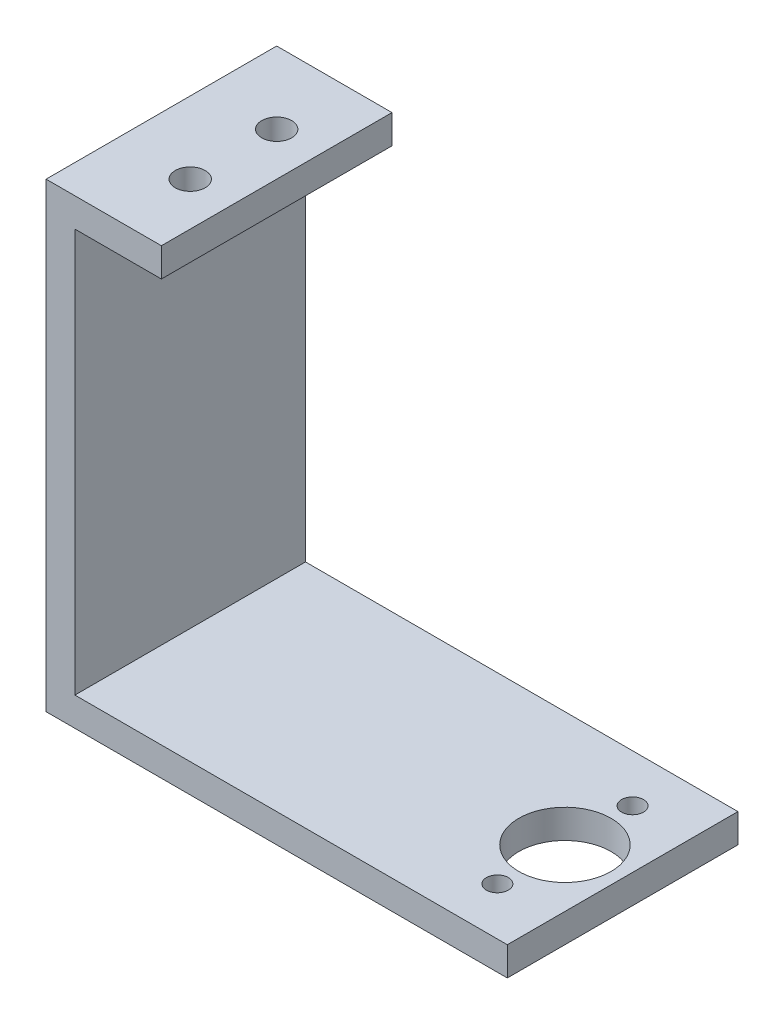
ISO-10303-21;
HEADER;
FILE_DESCRIPTION(('STEP AP214'),'2;1');
FILE_NAME('part.step','',(''),(''),'','','');
FILE_SCHEMA(('AUTOMOTIVE_DESIGN { 1 0 10303 214 1 1 1 1 }'));
ENDSEC;
DATA;
#1=APPLICATION_CONTEXT('core data for automotive mechanical design processes');
#2=APPLICATION_PROTOCOL_DEFINITION('international standard','automotive_design',2000,#1);
#3=PRODUCT_CONTEXT('',#1,'mechanical');
#4=PRODUCT('Part','Part','',(#3));
#5=PRODUCT_RELATED_PRODUCT_CATEGORY('part','',(#4));
#6=PRODUCT_DEFINITION_FORMATION('','',#4);
#7=PRODUCT_DEFINITION_CONTEXT('part definition',#1,'design');
#8=PRODUCT_DEFINITION('design','',#6,#7);
#9=PRODUCT_DEFINITION_SHAPE('','',#8);
#10=(LENGTH_UNIT() NAMED_UNIT(*) SI_UNIT(.MILLI.,.METRE.));
#11=(NAMED_UNIT(*) PLANE_ANGLE_UNIT() SI_UNIT($,.RADIAN.));
#12=(NAMED_UNIT(*) SI_UNIT($,.STERADIAN.) SOLID_ANGLE_UNIT());
#13=UNCERTAINTY_MEASURE_WITH_UNIT(LENGTH_MEASURE(1.E-05),#10,'distance_accuracy_value','');
#14=(GEOMETRIC_REPRESENTATION_CONTEXT(3) GLOBAL_UNCERTAINTY_ASSIGNED_CONTEXT((#13)) GLOBAL_UNIT_ASSIGNED_CONTEXT((#10,
#11,#12)) REPRESENTATION_CONTEXT('',''));
#15=CARTESIAN_POINT('',(0.,0.,0.));
#16=DIRECTION('',(0.,0.,1.));
#17=DIRECTION('',(1.,0.,0.));
#18=AXIS2_PLACEMENT_3D('',#15,#16,#17);
#19=CARTESIAN_POINT('',(-17.0592750793869,26.9872138550957,25.4));
#20=DIRECTION('',(-1.,0.,0.));
#21=DIRECTION('',(0.,0.,1.));
#22=AXIS2_PLACEMENT_3D('',#19,#20,#21);
#23=PLANE('',#22);
#24=DIRECTION('',(0.,1.,0.));
#25=VECTOR('',#24,1.);
#26=CARTESIAN_POINT('',(-17.0592750793869,26.9872138550957,0.));
#27=LINE('',#26,#25);
#28=CARTESIAN_POINT('',(-17.0592750793869,23.8122138550957,0.));
#29=VERTEX_POINT('',#28);
#30=CARTESIAN_POINT('',(-17.0592750793869,26.9872138550957,0.));
#31=VERTEX_POINT('',#30);
#32=EDGE_CURVE('E132',#29,#31,#27,.T.);
#33=ORIENTED_EDGE('',*,*,#32,.T.);
#34=DIRECTION('',(0.,0.,-1.));
#35=VECTOR('',#34,1.);
#36=CARTESIAN_POINT('',(-17.0592750793869,26.9872138550957,25.4));
#37=LINE('',#36,#35);
#38=CARTESIAN_POINT('',(-17.0592750793869,26.9872138550957,25.4));
#39=VERTEX_POINT('',#38);
#40=EDGE_CURVE('E11',#39,#31,#37,.T.);
#41=ORIENTED_EDGE('',*,*,#40,.F.);
#42=DIRECTION('',(0.,1.,0.));
#43=VECTOR('',#42,1.);
#44=CARTESIAN_POINT('',(-17.0592750793869,26.9872138550957,25.4));
#45=LINE('',#44,#43);
#46=CARTESIAN_POINT('',(-17.0592750793869,23.8122138550957,25.4));
#47=VERTEX_POINT('',#46);
#48=EDGE_CURVE('E147',#47,#39,#45,.T.);
#49=ORIENTED_EDGE('',*,*,#48,.F.);
#50=DIRECTION('',(0.,0.,-1.));
#51=VECTOR('',#50,1.);
#52=CARTESIAN_POINT('',(-17.0592750793869,23.8122138550957,25.4));
#53=LINE('',#52,#51);
#54=EDGE_CURVE('E128',#47,#29,#53,.T.);
#55=ORIENTED_EDGE('',*,*,#54,.T.);
#56=EDGE_LOOP('',(#33,#41,#49,#55));
#57=FACE_BOUND('',#56,.T.);
#58=ADVANCED_FACE('F34',(#57),#23,.F.);
#59=CARTESIAN_POINT('',(-17.0592750793869,26.9872138550957,25.4));
#60=DIRECTION('',(0.,-1.,0.));
#61=DIRECTION('',(1.,0.,0.));
#62=AXIS2_PLACEMENT_3D('',#59,#60,#61);
#63=PLANE('',#62);
#64=CARTESIAN_POINT('',(-21.8217750793869,26.9872138550957,7.9375));
#65=DIRECTION('',(0.,1.,0.));
#66=DIRECTION('',(0.,0.,1.));
#67=AXIS2_PLACEMENT_3D('',#64,#65,#66);
#68=CIRCLE('',#67,1.65);
#69=CARTESIAN_POINT('',(-21.8217750793869,26.9872138550957,9.5875));
#70=VERTEX_POINT('',#69);
#71=EDGE_CURVE('E167',#70,#70,#68,.T.);
#72=ORIENTED_EDGE('',*,*,#71,.F.);
#73=EDGE_LOOP('',(#72));
#74=FACE_BOUND('',#73,.T.);
#75=CARTESIAN_POINT('',(-21.8217750793869,26.9872138550957,17.4625));
#76=DIRECTION('',(0.,1.,0.));
#77=DIRECTION('',(0.,0.,1.));
#78=AXIS2_PLACEMENT_3D('',#75,#76,#77);
#79=CIRCLE('',#78,1.65);
#80=CARTESIAN_POINT('',(-21.8217750793869,26.9872138550957,19.1125));
#81=VERTEX_POINT('',#80);
#82=EDGE_CURVE('E159',#81,#81,#79,.T.);
#83=ORIENTED_EDGE('',*,*,#82,.F.);
#84=EDGE_LOOP('',(#83));
#85=FACE_BOUND('',#84,.T.);
#86=DIRECTION('',(-1.,0.,0.));
#87=VECTOR('',#86,1.);
#88=CARTESIAN_POINT('',(-17.0592750793869,26.9872138550957,0.));
#89=LINE('',#88,#87);
#90=CARTESIAN_POINT('',(-29.7592750793869,26.9872138550957,0.));
#91=VERTEX_POINT('',#90);
#92=EDGE_CURVE('E135',#31,#91,#89,.T.);
#93=ORIENTED_EDGE('',*,*,#92,.T.);
#94=DIRECTION('',(0.,0.,-1.));
#95=VECTOR('',#94,1.);
#96=CARTESIAN_POINT('',(-29.7592750793869,26.9872138550957,25.4));
#97=LINE('',#96,#95);
#98=CARTESIAN_POINT('',(-29.7592750793869,26.9872138550957,25.4));
#99=VERTEX_POINT('',#98);
#100=EDGE_CURVE('E43',#99,#91,#97,.T.);
#101=ORIENTED_EDGE('',*,*,#100,.F.);
#102=DIRECTION('',(-1.,0.,0.));
#103=VECTOR('',#102,1.);
#104=CARTESIAN_POINT('',(-17.0592750793869,26.9872138550957,25.4));
#105=LINE('',#104,#103);
#106=EDGE_CURVE('E95',#39,#99,#105,.T.);
#107=ORIENTED_EDGE('',*,*,#106,.F.);
#108=ORIENTED_EDGE('',*,*,#40,.T.);
#109=EDGE_LOOP('',(#93,#101,#107,#108));
#110=FACE_BOUND('',#109,.T.);
#111=ADVANCED_FACE('F205',(#74,#85,#110),#63,.F.);
#112=CARTESIAN_POINT('',(-29.7592750793869,26.9872138550957,25.4));
#113=DIRECTION('',(1.,0.,0.));
#114=DIRECTION('',(0.,1.,0.));
#115=AXIS2_PLACEMENT_3D('',#112,#113,#114);
#116=PLANE('',#115);
#117=DIRECTION('',(0.,-1.,0.));
#118=VECTOR('',#117,1.);
#119=CARTESIAN_POINT('',(-29.7592750793869,26.9872138550957,0.));
#120=LINE('',#119,#118);
#121=CARTESIAN_POINT('',(-29.7592750793869,-23.8127861449043,0.));
#122=VERTEX_POINT('',#121);
#123=EDGE_CURVE('E138',#91,#122,#120,.T.);
#124=ORIENTED_EDGE('',*,*,#123,.T.);
#125=DIRECTION('',(0.,0.,-1.));
#126=VECTOR('',#125,1.);
#127=CARTESIAN_POINT('',(-29.7592750793869,-23.8127861449043,25.4));
#128=LINE('',#127,#126);
#129=CARTESIAN_POINT('',(-29.7592750793869,-23.8127861449043,25.4));
#130=VERTEX_POINT('',#129);
#131=EDGE_CURVE('E154',#130,#122,#128,.T.);
#132=ORIENTED_EDGE('',*,*,#131,.F.);
#133=DIRECTION('',(0.,-1.,0.));
#134=VECTOR('',#133,1.);
#135=CARTESIAN_POINT('',(-29.7592750793869,26.9872138550957,25.4));
#136=LINE('',#135,#134);
#137=EDGE_CURVE('E173',#99,#130,#136,.T.);
#138=ORIENTED_EDGE('',*,*,#137,.F.);
#139=ORIENTED_EDGE('',*,*,#100,.T.);
#140=EDGE_LOOP('',(#124,#132,#138,#139));
#141=FACE_BOUND('',#140,.T.);
#142=ADVANCED_FACE('F209',(#141),#116,.F.);
#143=CARTESIAN_POINT('',(-29.7592750793869,-23.8127861449043,25.4));
#144=DIRECTION('',(0.,1.,0.));
#145=DIRECTION('',(0.,0.,1.));
#146=AXIS2_PLACEMENT_3D('',#143,#144,#145);
#147=PLANE('',#146);
#148=CARTESIAN_POINT('',(14.6907249206131,-23.8127861449043,20.1422));
#149=DIRECTION('',(0.,-1.,0.));
#150=DIRECTION('',(0.,0.,-1.));
#151=AXIS2_PLACEMENT_3D('',#148,#149,#150);
#152=CIRCLE('',#151,1.2065);
#153=CARTESIAN_POINT('',(14.6907249206131,-23.8127861449043,18.9357));
#154=VERTEX_POINT('',#153);
#155=EDGE_CURVE('E250',#154,#154,#152,.T.);
#156=ORIENTED_EDGE('',*,*,#155,.F.);
#157=EDGE_LOOP('',(#156));
#158=FACE_BOUND('',#157,.T.);
#159=CARTESIAN_POINT('',(14.6907249206131,-23.8127861449043,5.2578));
#160=DIRECTION('',(0.,-1.,0.));
#161=DIRECTION('',(0.,0.,-1.));
#162=AXIS2_PLACEMENT_3D('',#159,#160,#161);
#163=CIRCLE('',#162,1.2065);
#164=CARTESIAN_POINT('',(14.6907249206131,-23.8127861449043,4.0513));
#165=VERTEX_POINT('',#164);
#166=EDGE_CURVE('E246',#165,#165,#163,.T.);
#167=ORIENTED_EDGE('',*,*,#166,.F.);
#168=EDGE_LOOP('',(#167));
#169=FACE_BOUND('',#168,.T.);
#170=CARTESIAN_POINT('',(14.6907249206131,-23.8127861449043,12.7));
#171=DIRECTION('',(0.,-1.,0.));
#172=DIRECTION('',(0.,0.,-1.));
#173=AXIS2_PLACEMENT_3D('',#170,#171,#172);
#174=CIRCLE('',#173,5.08);
#175=CARTESIAN_POINT('',(14.6907249206131,-23.8127861449043,7.62));
#176=VERTEX_POINT('',#175);
#177=EDGE_CURVE('E240',#176,#176,#174,.T.);
#178=ORIENTED_EDGE('',*,*,#177,.F.);
#179=EDGE_LOOP('',(#178));
#180=FACE_BOUND('',#179,.T.);
#181=DIRECTION('',(1.,0.,0.));
#182=VECTOR('',#181,1.);
#183=CARTESIAN_POINT('',(-29.7592750793869,-23.8127861449043,0.));
#184=LINE('',#183,#182);
#185=CARTESIAN_POINT('',(21.0407249206131,-23.8127861449043,0.));
#186=VERTEX_POINT('',#185);
#187=EDGE_CURVE('E140',#122,#186,#184,.T.);
#188=ORIENTED_EDGE('',*,*,#187,.T.);
#189=DIRECTION('',(0.,0.,-1.));
#190=VECTOR('',#189,1.);
#191=CARTESIAN_POINT('',(21.0407249206131,-23.8127861449043,25.4));
#192=LINE('',#191,#190);
#193=CARTESIAN_POINT('',(21.0407249206131,-23.8127861449043,25.4));
#194=VERTEX_POINT('',#193);
#195=EDGE_CURVE('E151',#194,#186,#192,.T.);
#196=ORIENTED_EDGE('',*,*,#195,.F.);
#197=DIRECTION('',(1.,0.,0.));
#198=VECTOR('',#197,1.);
#199=CARTESIAN_POINT('',(-29.7592750793869,-23.8127861449043,25.4));
#200=LINE('',#199,#198);
#201=EDGE_CURVE('E175',#130,#194,#200,.T.);
#202=ORIENTED_EDGE('',*,*,#201,.F.);
#203=ORIENTED_EDGE('',*,*,#131,.T.);
#204=EDGE_LOOP('',(#188,#196,#202,#203));
#205=FACE_BOUND('',#204,.T.);
#206=ADVANCED_FACE('F181',(#158,#169,#180,#205),#147,.F.);
#207=CARTESIAN_POINT('',(21.0407249206131,-23.8127861449043,25.4));
#208=DIRECTION('',(-1.,0.,0.));
#209=DIRECTION('',(0.,-1.,0.));
#210=AXIS2_PLACEMENT_3D('',#207,#208,#209);
#211=PLANE('',#210);
#212=DIRECTION('',(0.,1.,0.));
#213=VECTOR('',#212,1.);
#214=CARTESIAN_POINT('',(21.0407249206131,-23.8127861449043,0.));
#215=LINE('',#214,#213);
#216=CARTESIAN_POINT('',(21.0407249206131,-20.6377861449043,0.));
#217=VERTEX_POINT('',#216);
#218=EDGE_CURVE('E142',#186,#217,#215,.T.);
#219=ORIENTED_EDGE('',*,*,#218,.T.);
#220=DIRECTION('',(0.,0.,-1.));
#221=VECTOR('',#220,1.);
#222=CARTESIAN_POINT('',(21.0407249206131,-20.6377861449043,25.4));
#223=LINE('',#222,#221);
#224=CARTESIAN_POINT('',(21.0407249206131,-20.6377861449043,25.4));
#225=VERTEX_POINT('',#224);
#226=EDGE_CURVE('E123',#225,#217,#223,.T.);
#227=ORIENTED_EDGE('',*,*,#226,.F.);
#228=DIRECTION('',(0.,1.,0.));
#229=VECTOR('',#228,1.);
#230=CARTESIAN_POINT('',(21.0407249206131,-23.8127861449043,25.4));
#231=LINE('',#230,#229);
#232=EDGE_CURVE('E114',#194,#225,#231,.T.);
#233=ORIENTED_EDGE('',*,*,#232,.F.);
#234=ORIENTED_EDGE('',*,*,#195,.T.);
#235=EDGE_LOOP('',(#219,#227,#233,#234));
#236=FACE_BOUND('',#235,.T.);
#237=ADVANCED_FACE('F185',(#236),#211,.F.);
#238=CARTESIAN_POINT('',(-26.5842750793869,-20.6377861449043,25.4));
#239=DIRECTION('',(0.,-1.,0.));
#240=DIRECTION('',(0.,0.,-1.));
#241=AXIS2_PLACEMENT_3D('',#238,#239,#240);
#242=PLANE('',#241);
#243=CARTESIAN_POINT('',(14.6907249206131,-20.6377861449043,20.1422));
#244=DIRECTION('',(0.,-1.,0.));
#245=DIRECTION('',(0.,0.,-1.));
#246=AXIS2_PLACEMENT_3D('',#243,#244,#245);
#247=CIRCLE('',#246,1.2065);
#248=CARTESIAN_POINT('',(14.6907249206131,-20.6377861449043,18.9357));
#249=VERTEX_POINT('',#248);
#250=EDGE_CURVE('E231',#249,#249,#247,.F.);
#251=ORIENTED_EDGE('',*,*,#250,.F.);
#252=EDGE_LOOP('',(#251));
#253=FACE_BOUND('',#252,.T.);
#254=CARTESIAN_POINT('',(14.6907249206131,-20.6377861449043,5.2578));
#255=DIRECTION('',(0.,-1.,0.));
#256=DIRECTION('',(0.,0.,-1.));
#257=AXIS2_PLACEMENT_3D('',#254,#255,#256);
#258=CIRCLE('',#257,1.2065);
#259=CARTESIAN_POINT('',(14.6907249206131,-20.6377861449043,4.0513));
#260=VERTEX_POINT('',#259);
#261=EDGE_CURVE('E235',#260,#260,#258,.F.);
#262=ORIENTED_EDGE('',*,*,#261,.F.);
#263=EDGE_LOOP('',(#262));
#264=FACE_BOUND('',#263,.T.);
#265=CARTESIAN_POINT('',(14.6907249206131,-20.6377861449043,12.7));
#266=DIRECTION('',(0.,-1.,0.));
#267=DIRECTION('',(0.,0.,-1.));
#268=AXIS2_PLACEMENT_3D('',#265,#266,#267);
#269=CIRCLE('',#268,5.08);
#270=CARTESIAN_POINT('',(14.6907249206131,-20.6377861449043,7.62));
#271=VERTEX_POINT('',#270);
#272=EDGE_CURVE('E238',#271,#271,#269,.F.);
#273=ORIENTED_EDGE('',*,*,#272,.F.);
#274=EDGE_LOOP('',(#273));
#275=FACE_BOUND('',#274,.T.);
#276=DIRECTION('',(-1.,0.,0.));
#277=VECTOR('',#276,1.);
#278=CARTESIAN_POINT('',(-26.5842750793869,-20.6377861449043,0.));
#279=LINE('',#278,#277);
#280=CARTESIAN_POINT('',(-26.5842750793869,-20.6377861449043,0.));
#281=VERTEX_POINT('',#280);
#282=EDGE_CURVE('E122',#217,#281,#279,.T.);
#283=ORIENTED_EDGE('',*,*,#282,.T.);
#284=DIRECTION('',(0.,0.,-1.));
#285=VECTOR('',#284,1.);
#286=CARTESIAN_POINT('',(-26.5842750793869,-20.6377861449043,25.4));
#287=LINE('',#286,#285);
#288=CARTESIAN_POINT('',(-26.5842750793869,-20.6377861449043,25.4));
#289=VERTEX_POINT('',#288);
#290=EDGE_CURVE('E119',#289,#281,#287,.T.);
#291=ORIENTED_EDGE('',*,*,#290,.F.);
#292=DIRECTION('',(-1.,0.,0.));
#293=VECTOR('',#292,1.);
#294=CARTESIAN_POINT('',(-26.5842750793869,-20.6377861449043,25.4));
#295=LINE('',#294,#293);
#296=EDGE_CURVE('E108',#225,#289,#295,.T.);
#297=ORIENTED_EDGE('',*,*,#296,.F.);
#298=ORIENTED_EDGE('',*,*,#226,.T.);
#299=EDGE_LOOP('',(#283,#291,#297,#298));
#300=FACE_BOUND('',#299,.T.);
#301=ADVANCED_FACE('F120',(#253,#264,#275,#300),#242,.F.);
#302=CARTESIAN_POINT('',(-26.5842750793869,23.8122138550957,25.4));
#303=DIRECTION('',(-1.,0.,0.));
#304=DIRECTION('',(0.,-1.,0.));
#305=AXIS2_PLACEMENT_3D('',#302,#303,#304);
#306=PLANE('',#305);
#307=DIRECTION('',(0.,1.,0.));
#308=VECTOR('',#307,1.);
#309=CARTESIAN_POINT('',(-26.5842750793869,23.8122138550957,0.));
#310=LINE('',#309,#308);
#311=CARTESIAN_POINT('',(-26.5842750793869,23.8122138550957,0.));
#312=VERTEX_POINT('',#311);
#313=EDGE_CURVE('E81',#281,#312,#310,.T.);
#314=ORIENTED_EDGE('',*,*,#313,.T.);
#315=DIRECTION('',(0.,0.,-1.));
#316=VECTOR('',#315,1.);
#317=CARTESIAN_POINT('',(-26.5842750793869,23.8122138550957,25.4));
#318=LINE('',#317,#316);
#319=CARTESIAN_POINT('',(-26.5842750793869,23.8122138550957,25.4));
#320=VERTEX_POINT('',#319);
#321=EDGE_CURVE('E124',#320,#312,#318,.T.);
#322=ORIENTED_EDGE('',*,*,#321,.F.);
#323=DIRECTION('',(0.,1.,0.));
#324=VECTOR('',#323,1.);
#325=CARTESIAN_POINT('',(-26.5842750793869,23.8122138550957,25.4));
#326=LINE('',#325,#324);
#327=EDGE_CURVE('E112',#289,#320,#326,.T.);
#328=ORIENTED_EDGE('',*,*,#327,.F.);
#329=ORIENTED_EDGE('',*,*,#290,.T.);
#330=EDGE_LOOP('',(#314,#322,#328,#329));
#331=FACE_BOUND('',#330,.T.);
#332=ADVANCED_FACE('F126',(#331),#306,.F.);
#333=CARTESIAN_POINT('',(-17.0592750793869,23.8122138550957,25.4));
#334=DIRECTION('',(0.,1.,0.));
#335=DIRECTION('',(0.,0.,1.));
#336=AXIS2_PLACEMENT_3D('',#333,#334,#335);
#337=PLANE('',#336);
#338=CARTESIAN_POINT('',(-21.8217750793869,23.8122138550957,7.9375));
#339=DIRECTION('',(0.,1.,0.));
#340=DIRECTION('',(0.,0.,1.));
#341=AXIS2_PLACEMENT_3D('',#338,#339,#340);
#342=CIRCLE('',#341,1.65);
#343=CARTESIAN_POINT('',(-21.8217750793869,23.8122138550957,9.5875));
#344=VERTEX_POINT('',#343);
#345=EDGE_CURVE('E37',#344,#344,#342,.T.);
#346=ORIENTED_EDGE('',*,*,#345,.T.);
#347=EDGE_LOOP('',(#346));
#348=FACE_BOUND('',#347,.T.);
#349=CARTESIAN_POINT('',(-21.8217750793869,23.8122138550957,17.4625));
#350=DIRECTION('',(0.,1.,0.));
#351=DIRECTION('',(0.,0.,1.));
#352=AXIS2_PLACEMENT_3D('',#349,#350,#351);
#353=CIRCLE('',#352,1.65);
#354=CARTESIAN_POINT('',(-21.8217750793869,23.8122138550957,19.1125));
#355=VERTEX_POINT('',#354);
#356=EDGE_CURVE('E136',#355,#355,#353,.T.);
#357=ORIENTED_EDGE('',*,*,#356,.T.);
#358=EDGE_LOOP('',(#357));
#359=FACE_BOUND('',#358,.T.);
#360=DIRECTION('',(1.,0.,0.));
#361=VECTOR('',#360,1.);
#362=CARTESIAN_POINT('',(-17.0592750793869,23.8122138550957,0.));
#363=LINE('',#362,#361);
#364=EDGE_CURVE('E87',#312,#29,#363,.T.);
#365=ORIENTED_EDGE('',*,*,#364,.T.);
#366=ORIENTED_EDGE('',*,*,#54,.F.);
#367=DIRECTION('',(1.,0.,0.));
#368=VECTOR('',#367,1.);
#369=CARTESIAN_POINT('',(-17.0592750793869,23.8122138550957,25.4));
#370=LINE('',#369,#368);
#371=EDGE_CURVE('E52',#320,#47,#370,.T.);
#372=ORIENTED_EDGE('',*,*,#371,.F.);
#373=ORIENTED_EDGE('',*,*,#321,.T.);
#374=EDGE_LOOP('',(#365,#366,#372,#373));
#375=FACE_BOUND('',#374,.T.);
#376=ADVANCED_FACE('F193',(#348,#359,#375),#337,.F.);
#377=CARTESIAN_POINT('',(0.,0.,25.4));
#378=DIRECTION('',(0.,0.,-1.));
#379=DIRECTION('',(-1.,0.,0.));
#380=AXIS2_PLACEMENT_3D('',#377,#378,#379);
#381=PLANE('',#380);
#382=ORIENTED_EDGE('',*,*,#48,.T.);
#383=ORIENTED_EDGE('',*,*,#106,.T.);
#384=ORIENTED_EDGE('',*,*,#137,.T.);
#385=ORIENTED_EDGE('',*,*,#201,.T.);
#386=ORIENTED_EDGE('',*,*,#232,.T.);
#387=ORIENTED_EDGE('',*,*,#296,.T.);
#388=ORIENTED_EDGE('',*,*,#327,.T.);
#389=ORIENTED_EDGE('',*,*,#371,.T.);
#390=EDGE_LOOP('',(#382,#383,#384,#385,#386,#387,#388,#389));
#391=FACE_BOUND('',#390,.T.);
#392=ADVANCED_FACE('F110',(#391),#381,.F.);
#393=CARTESIAN_POINT('',(0.,0.,0.));
#394=DIRECTION('',(0.,0.,-1.));
#395=DIRECTION('',(-1.,0.,0.));
#396=AXIS2_PLACEMENT_3D('',#393,#394,#395);
#397=PLANE('',#396);
#398=ORIENTED_EDGE('',*,*,#32,.F.);
#399=ORIENTED_EDGE('',*,*,#364,.F.);
#400=ORIENTED_EDGE('',*,*,#313,.F.);
#401=ORIENTED_EDGE('',*,*,#282,.F.);
#402=ORIENTED_EDGE('',*,*,#218,.F.);
#403=ORIENTED_EDGE('',*,*,#187,.F.);
#404=ORIENTED_EDGE('',*,*,#123,.F.);
#405=ORIENTED_EDGE('',*,*,#92,.F.);
#406=EDGE_LOOP('',(#398,#399,#400,#401,#402,#403,#404,#405));
#407=FACE_BOUND('',#406,.T.);
#408=ADVANCED_FACE('F188',(#407),#397,.T.);
#409=CARTESIAN_POINT('',(-21.8217750793869,26.9872138550957,17.4625));
#410=DIRECTION('',(0.,1.,0.));
#411=DIRECTION('',(0.,0.,1.));
#412=AXIS2_PLACEMENT_3D('',#409,#410,#411);
#413=CYLINDRICAL_SURFACE('',#412,1.65);
#414=ORIENTED_EDGE('',*,*,#82,.T.);
#415=EDGE_LOOP('',(#414));
#416=FACE_BOUND('',#415,.T.);
#417=ORIENTED_EDGE('',*,*,#356,.F.);
#418=EDGE_LOOP('',(#417));
#419=FACE_BOUND('',#418,.T.);
#420=ADVANCED_FACE('F272',(#416,#419),#413,.F.);
#421=CARTESIAN_POINT('',(-21.8217750793869,26.9872138550957,7.9375));
#422=DIRECTION('',(0.,1.,0.));
#423=DIRECTION('',(0.,0.,1.));
#424=AXIS2_PLACEMENT_3D('',#421,#422,#423);
#425=CYLINDRICAL_SURFACE('',#424,1.65);
#426=ORIENTED_EDGE('',*,*,#71,.T.);
#427=EDGE_LOOP('',(#426));
#428=FACE_BOUND('',#427,.T.);
#429=ORIENTED_EDGE('',*,*,#345,.F.);
#430=EDGE_LOOP('',(#429));
#431=FACE_BOUND('',#430,.T.);
#432=ADVANCED_FACE('F264',(#428,#431),#425,.F.);
#433=CARTESIAN_POINT('',(14.6907249206131,26.9882138550957,12.7));
#434=DIRECTION('',(0.,-1.,0.));
#435=DIRECTION('',(0.,0.,-1.));
#436=AXIS2_PLACEMENT_3D('',#433,#434,#435);
#437=CYLINDRICAL_SURFACE('',#436,5.08);
#438=ORIENTED_EDGE('',*,*,#177,.T.);
#439=EDGE_LOOP('',(#438));
#440=FACE_BOUND('',#439,.T.);
#441=ORIENTED_EDGE('',*,*,#272,.T.);
#442=EDGE_LOOP('',(#441));
#443=FACE_BOUND('',#442,.T.);
#444=ADVANCED_FACE('F261',(#440,#443),#437,.F.);
#445=CARTESIAN_POINT('',(14.6907249206131,26.9882138550957,5.2578));
#446=DIRECTION('',(0.,-1.,0.));
#447=DIRECTION('',(0.,0.,-1.));
#448=AXIS2_PLACEMENT_3D('',#445,#446,#447);
#449=CYLINDRICAL_SURFACE('',#448,1.2065);
#450=ORIENTED_EDGE('',*,*,#166,.T.);
#451=EDGE_LOOP('',(#450));
#452=FACE_BOUND('',#451,.T.);
#453=ORIENTED_EDGE('',*,*,#261,.T.);
#454=EDGE_LOOP('',(#453));
#455=FACE_BOUND('',#454,.T.);
#456=ADVANCED_FACE('F263',(#452,#455),#449,.F.);
#457=CARTESIAN_POINT('',(14.6907249206131,26.9882138550957,20.1422));
#458=DIRECTION('',(0.,-1.,0.));
#459=DIRECTION('',(0.,0.,-1.));
#460=AXIS2_PLACEMENT_3D('',#457,#458,#459);
#461=CYLINDRICAL_SURFACE('',#460,1.2065);
#462=ORIENTED_EDGE('',*,*,#155,.T.);
#463=EDGE_LOOP('',(#462));
#464=FACE_BOUND('',#463,.T.);
#465=ORIENTED_EDGE('',*,*,#250,.T.);
#466=EDGE_LOOP('',(#465));
#467=FACE_BOUND('',#466,.T.);
#468=ADVANCED_FACE('F254',(#464,#467),#461,.F.);
#469=CLOSED_SHELL('',(#58,#111,#142,#206,#237,#301,#332,#376,#392,#408,#420,#432,#444,#456,#468));
#470=MANIFOLD_SOLID_BREP('B2',#469);
#471=ADVANCED_BREP_SHAPE_REPRESENTATION('',(#18,#470),#14);
#472=SHAPE_DEFINITION_REPRESENTATION(#9,#471);
ENDSEC;
END-ISO-10303-21;
